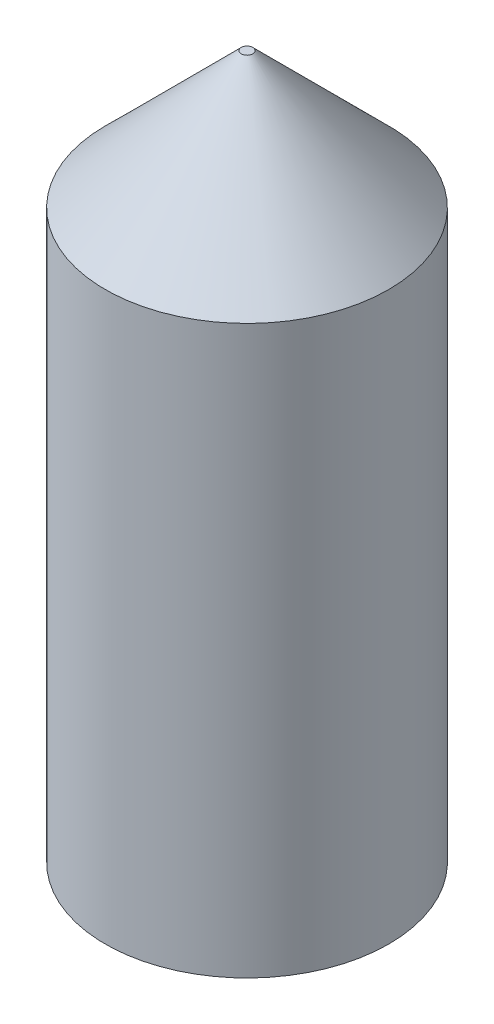
ISO-10303-21;
HEADER;
FILE_DESCRIPTION(('STEP AP214'),'2;1');
FILE_NAME('part.step','',(''),(''),'','','');
FILE_SCHEMA(('AUTOMOTIVE_DESIGN { 1 0 10303 214 1 1 1 1 }'));
ENDSEC;
DATA;
#1=APPLICATION_CONTEXT('core data for automotive mechanical design processes');
#2=APPLICATION_PROTOCOL_DEFINITION('international standard','automotive_design',2000,#1);
#3=PRODUCT_CONTEXT('',#1,'mechanical');
#4=PRODUCT('Part','Part','',(#3));
#5=PRODUCT_RELATED_PRODUCT_CATEGORY('part','',(#4));
#6=PRODUCT_DEFINITION_FORMATION('','',#4);
#7=PRODUCT_DEFINITION_CONTEXT('part definition',#1,'design');
#8=PRODUCT_DEFINITION('design','',#6,#7);
#9=PRODUCT_DEFINITION_SHAPE('','',#8);
#10=(LENGTH_UNIT() NAMED_UNIT(*) SI_UNIT(.MILLI.,.METRE.));
#11=(NAMED_UNIT(*) PLANE_ANGLE_UNIT() SI_UNIT($,.RADIAN.));
#12=(NAMED_UNIT(*) SI_UNIT($,.STERADIAN.) SOLID_ANGLE_UNIT());
#13=UNCERTAINTY_MEASURE_WITH_UNIT(LENGTH_MEASURE(1.E-05),#10,'distance_accuracy_value','');
#14=(GEOMETRIC_REPRESENTATION_CONTEXT(3) GLOBAL_UNCERTAINTY_ASSIGNED_CONTEXT((#13)) GLOBAL_UNIT_ASSIGNED_CONTEXT((#10,
#11,#12)) REPRESENTATION_CONTEXT('',''));
#15=CARTESIAN_POINT('',(0.,0.,0.));
#16=DIRECTION('',(0.,0.,1.));
#17=DIRECTION('',(1.,0.,0.));
#18=AXIS2_PLACEMENT_3D('',#15,#16,#17);
#19=CARTESIAN_POINT('',(0.,2.4,0.));
#20=DIRECTION('',(0.,1.,0.));
#21=DIRECTION('',(-1.,0.,0.));
#22=AXIS2_PLACEMENT_3D('',#19,#20,#21);
#23=PLANE('',#22);
#24=CARTESIAN_POINT('',(0.,2.4,0.));
#25=DIRECTION('',(0.,-1.,0.));
#26=DIRECTION('',(1.,0.,0.));
#27=AXIS2_PLACEMENT_3D('',#24,#25,#26);
#28=CIRCLE('',#27,0.100000000000008);
#29=CARTESIAN_POINT('',(0.1,2.4,0.));
#30=VERTEX_POINT('',#29);
#31=EDGE_CURVE('E10',#30,#30,#28,.T.);
#32=ORIENTED_EDGE('',*,*,#31,.F.);
#33=EDGE_LOOP('',(#32));
#34=FACE_BOUND('',#33,.T.);
#35=ADVANCED_FACE('F37',(#34),#23,.T.);
#36=CARTESIAN_POINT('',(0.,0.,0.));
#37=DIRECTION('',(0.,-1.,0.));
#38=DIRECTION('',(1.,0.,0.));
#39=AXIS2_PLACEMENT_3D('',#36,#37,#38);
#40=CONICAL_SURFACE('',#39,2.5,0.785398163397444);
#41=CARTESIAN_POINT('',(0.,0.,0.));
#42=DIRECTION('',(0.,-1.,0.));
#43=DIRECTION('',(1.,0.,0.));
#44=AXIS2_PLACEMENT_3D('',#41,#42,#43);
#45=CIRCLE('',#44,2.5);
#46=CARTESIAN_POINT('',(2.5,0.,0.));
#47=VERTEX_POINT('',#46);
#48=EDGE_CURVE('E44',#47,#47,#45,.T.);
#49=CARTESIAN_POINT('',(0.1,2.4,0.));
#50=CARTESIAN_POINT('',(0.125,2.375,0.));
#51=CARTESIAN_POINT('',(0.15,2.35,0.));
#52=CARTESIAN_POINT('',(0.2,2.3,0.));
#53=CARTESIAN_POINT('',(0.225,2.275,0.));
#54=CARTESIAN_POINT('',(0.275,2.225,0.));
#55=CARTESIAN_POINT('',(0.3,2.2,0.));
#56=CARTESIAN_POINT('',(0.35,2.15,0.));
#57=CARTESIAN_POINT('',(0.375,2.125,0.));
#58=CARTESIAN_POINT('',(0.425,2.075,0.));
#59=CARTESIAN_POINT('',(0.45,2.05,0.));
#60=CARTESIAN_POINT('',(0.5,2.,0.));
#61=CARTESIAN_POINT('',(0.525,1.975,0.));
#62=CARTESIAN_POINT('',(0.575,1.925,0.));
#63=CARTESIAN_POINT('',(0.6,1.9,0.));
#64=CARTESIAN_POINT('',(0.65,1.85,0.));
#65=CARTESIAN_POINT('',(0.675,1.825,0.));
#66=CARTESIAN_POINT('',(0.725,1.775,0.));
#67=CARTESIAN_POINT('',(0.75,1.75,0.));
#68=CARTESIAN_POINT('',(0.8,1.7,0.));
#69=CARTESIAN_POINT('',(0.825,1.675,0.));
#70=CARTESIAN_POINT('',(0.875,1.625,0.));
#71=CARTESIAN_POINT('',(0.9,1.6,0.));
#72=CARTESIAN_POINT('',(0.95,1.55,0.));
#73=CARTESIAN_POINT('',(0.975,1.525,0.));
#74=CARTESIAN_POINT('',(1.025,1.475,0.));
#75=CARTESIAN_POINT('',(1.05,1.45,0.));
#76=CARTESIAN_POINT('',(1.1,1.4,0.));
#77=CARTESIAN_POINT('',(1.125,1.375,0.));
#78=CARTESIAN_POINT('',(1.175,1.325,0.));
#79=CARTESIAN_POINT('',(1.2,1.3,0.));
#80=CARTESIAN_POINT('',(1.25,1.25,0.));
#81=CARTESIAN_POINT('',(1.275,1.225,0.));
#82=CARTESIAN_POINT('',(1.325,1.175,0.));
#83=CARTESIAN_POINT('',(1.35,1.15,0.));
#84=CARTESIAN_POINT('',(1.4,1.1,0.));
#85=CARTESIAN_POINT('',(1.425,1.075,0.));
#86=CARTESIAN_POINT('',(1.475,1.025,0.));
#87=CARTESIAN_POINT('',(1.5,0.999999999999997,0.));
#88=CARTESIAN_POINT('',(1.55,0.949999999999997,0.));
#89=CARTESIAN_POINT('',(1.575,0.924999999999997,0.));
#90=CARTESIAN_POINT('',(1.625,0.874999999999997,0.));
#91=CARTESIAN_POINT('',(1.65,0.849999999999997,0.));
#92=CARTESIAN_POINT('',(1.7,0.799999999999996,0.));
#93=CARTESIAN_POINT('',(1.725,0.774999999999996,0.));
#94=CARTESIAN_POINT('',(1.775,0.724999999999996,0.));
#95=CARTESIAN_POINT('',(1.8,0.699999999999996,0.));
#96=CARTESIAN_POINT('',(1.85,0.649999999999996,0.));
#97=CARTESIAN_POINT('',(1.875,0.624999999999996,0.));
#98=CARTESIAN_POINT('',(1.925,0.574999999999996,0.));
#99=CARTESIAN_POINT('',(1.95,0.549999999999996,0.));
#100=CARTESIAN_POINT('',(2.,0.499999999999996,0.));
#101=CARTESIAN_POINT('',(2.025,0.474999999999996,0.));
#102=CARTESIAN_POINT('',(2.075,0.424999999999996,0.));
#103=CARTESIAN_POINT('',(2.1,0.399999999999996,0.));
#104=CARTESIAN_POINT('',(2.15,0.349999999999995,0.));
#105=CARTESIAN_POINT('',(2.175,0.324999999999995,0.));
#106=CARTESIAN_POINT('',(2.225,0.274999999999995,0.));
#107=CARTESIAN_POINT('',(2.25,0.249999999999995,0.));
#108=CARTESIAN_POINT('',(2.3,0.199999999999995,0.));
#109=CARTESIAN_POINT('',(2.325,0.174999999999995,0.));
#110=CARTESIAN_POINT('',(2.375,0.124999999999995,0.));
#111=CARTESIAN_POINT('',(2.4,0.0999999999999949,0.));
#112=CARTESIAN_POINT('',(2.45,0.0499999999999948,0.));
#113=CARTESIAN_POINT('',(2.475,0.0249999999999948,0.));
#114=CARTESIAN_POINT('',(2.5,0.,0.));
#115=B_SPLINE_CURVE_WITH_KNOTS('',3,(#49,#50,#51,#52,#53,#54,#55,#56,#57,#58,#59,#60,#61,#62,
#63,#64,#65,#66,#67,#68,#69,#70,#71,#72,#73,#74,#75,#76,#77,#78,#79,#80,#81,#82,#83,#84,#85,#86,
#87,#88,#89,#90,#91,#92,#93,#94,#95,#96,#97,#98,#99,#100,#101,#102,#103,#104,#105,#106,#107,
#108,#109,#110,#111,#112,#113,#114),.UNSPECIFIED.,.F.,.F.,(4,2,2,2,2,2,2,2,2,2,2,2,2,2,2,2,2,2,
2,2,2,2,2,2,2,2,2,2,2,2,2,2,4),(0.,0.106066017177982,0.212132034355965,0.318198051533946,
0.424264068711929,0.530330085889911,0.636396103067893,0.742462120245876,0.848528137423858,
0.95459415460184,1.06066017177982,1.1667261889578,1.27279220613579,1.37885822331377,
1.48492424049175,1.59099025766973,1.69705627484772,1.8031222920257,1.90918830920368,
2.01525432638166,2.12132034355965,2.22738636073763,2.33345237791561,2.43951839509359,
2.54558441227157,2.65165042944956,2.75771644662754,2.86378246380552,2.9698484809835,
3.07591449816149,3.18198051533947,3.28804653251745,3.39411254969543),.UNSPECIFIED.);
#116=EDGE_CURVE('BSEAM61',#30,#47,#115,.T.);
#117=ORIENTED_EDGE('',*,*,#31,.T.);
#118=ORIENTED_EDGE('',*,*,#48,.F.);
#119=ORIENTED_EDGE('',*,*,#116,.T.);
#120=ORIENTED_EDGE('',*,*,#116,.F.);
#121=EDGE_LOOP('',(#117,#119,#118,#120));
#122=FACE_BOUND('',#121,.T.);
#123=ADVANCED_FACE('F61',(#122),#40,.T.);
#124=CARTESIAN_POINT('',(0.,-10.,0.));
#125=DIRECTION('',(0.,1.,0.));
#126=DIRECTION('',(-1.,0.,0.));
#127=AXIS2_PLACEMENT_3D('',#124,#125,#126);
#128=CYLINDRICAL_SURFACE('',#127,2.5);
#129=CARTESIAN_POINT('',(0.,-10.,0.));
#130=DIRECTION('',(0.,-1.,0.));
#131=DIRECTION('',(1.,0.,0.));
#132=AXIS2_PLACEMENT_3D('',#129,#130,#131);
#133=CIRCLE('',#132,2.5);
#134=CARTESIAN_POINT('',(2.50000000000003,-9.99999999999999,0.));
#135=VERTEX_POINT('',#134);
#136=EDGE_CURVE('E49',#135,#135,#133,.T.);
#137=ORIENTED_EDGE('',*,*,#136,.F.);
#138=EDGE_LOOP('',(#137));
#139=FACE_BOUND('',#138,.T.);
#140=ORIENTED_EDGE('',*,*,#48,.T.);
#141=EDGE_LOOP('',(#140));
#142=FACE_BOUND('',#141,.T.);
#143=ADVANCED_FACE('F59',(#139,#142),#128,.T.);
#144=CARTESIAN_POINT('',(0.,-10.,0.));
#145=DIRECTION('',(0.,-1.,0.));
#146=DIRECTION('',(1.,0.,0.));
#147=AXIS2_PLACEMENT_3D('',#144,#145,#146);
#148=PLANE('',#147);
#149=ORIENTED_EDGE('',*,*,#136,.T.);
#150=EDGE_LOOP('',(#149));
#151=FACE_BOUND('',#150,.T.);
#152=ADVANCED_FACE('F57',(#151),#148,.T.);
#153=CLOSED_SHELL('',(#35,#123,#143,#152));
#154=MANIFOLD_SOLID_BREP('B2',#153);
#155=ADVANCED_BREP_SHAPE_REPRESENTATION('',(#18,#154),#14);
#156=SHAPE_DEFINITION_REPRESENTATION(#9,#155);
ENDSEC;
END-ISO-10303-21;
